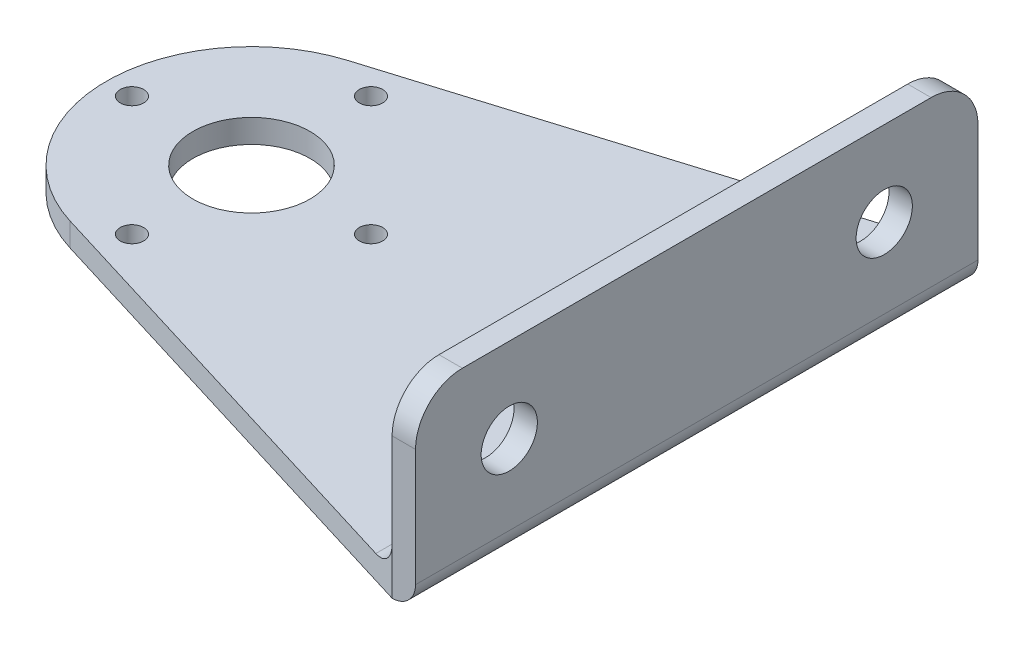
ISO-10303-21;
HEADER;
FILE_DESCRIPTION(('STEP AP214'),'2;1');
FILE_NAME('part.step','',(''),(''),'','','');
FILE_SCHEMA(('AUTOMOTIVE_DESIGN { 1 0 10303 214 1 1 1 1 }'));
ENDSEC;
DATA;
#1=APPLICATION_CONTEXT('core data for automotive mechanical design processes');
#2=APPLICATION_PROTOCOL_DEFINITION('international standard','automotive_design',2000,#1);
#3=PRODUCT_CONTEXT('',#1,'mechanical');
#4=PRODUCT('Part','Part','',(#3));
#5=PRODUCT_RELATED_PRODUCT_CATEGORY('part','',(#4));
#6=PRODUCT_DEFINITION_FORMATION('','',#4);
#7=PRODUCT_DEFINITION_CONTEXT('part definition',#1,'design');
#8=PRODUCT_DEFINITION('design','',#6,#7);
#9=PRODUCT_DEFINITION_SHAPE('','',#8);
#10=(LENGTH_UNIT() NAMED_UNIT(*) SI_UNIT(.MILLI.,.METRE.));
#11=(NAMED_UNIT(*) PLANE_ANGLE_UNIT() SI_UNIT($,.RADIAN.));
#12=(NAMED_UNIT(*) SI_UNIT($,.STERADIAN.) SOLID_ANGLE_UNIT());
#13=UNCERTAINTY_MEASURE_WITH_UNIT(LENGTH_MEASURE(1.E-05),#10,'distance_accuracy_value','');
#14=(GEOMETRIC_REPRESENTATION_CONTEXT(3) GLOBAL_UNCERTAINTY_ASSIGNED_CONTEXT((#13)) GLOBAL_UNIT_ASSIGNED_CONTEXT((#10,
#11,#12)) REPRESENTATION_CONTEXT('',''));
#15=CARTESIAN_POINT('',(0.,0.,0.));
#16=DIRECTION('',(0.,0.,1.));
#17=DIRECTION('',(1.,0.,0.));
#18=AXIS2_PLACEMENT_3D('',#15,#16,#17);
#19=CARTESIAN_POINT('',(0.,5.,0.));
#20=DIRECTION('',(0.,1.,0.));
#21=DIRECTION('',(0.,0.,1.));
#22=AXIS2_PLACEMENT_3D('',#19,#20,#21);
#23=PLANE('',#22);
#24=CARTESIAN_POINT('',(0.,5.,25.5));
#25=DIRECTION('',(0.,1.,0.));
#26=DIRECTION('',(0.,0.,1.));
#27=AXIS2_PLACEMENT_3D('',#24,#25,#26);
#28=CIRCLE('',#27,2.5);
#29=CARTESIAN_POINT('',(0.,5.,28.));
#30=VERTEX_POINT('',#29);
#31=EDGE_CURVE('E163',#30,#30,#28,.T.);
#32=ORIENTED_EDGE('',*,*,#31,.F.);
#33=EDGE_LOOP('',(#32));
#34=FACE_BOUND('',#33,.T.);
#35=CARTESIAN_POINT('',(-25.5,5.,0.));
#36=DIRECTION('',(0.,1.,0.));
#37=DIRECTION('',(0.,0.,1.));
#38=AXIS2_PLACEMENT_3D('',#35,#36,#37);
#39=CIRCLE('',#38,2.5);
#40=CARTESIAN_POINT('',(-25.5,5.,2.5));
#41=VERTEX_POINT('',#40);
#42=EDGE_CURVE('E175',#41,#41,#39,.T.);
#43=ORIENTED_EDGE('',*,*,#42,.F.);
#44=EDGE_LOOP('',(#43));
#45=FACE_BOUND('',#44,.T.);
#46=DIRECTION('',(0.956121639583312,0.,0.29296998194443));
#47=VECTOR('',#46,1.);
#48=CARTESIAN_POINT('',(90.,5.,60.));
#49=LINE('',#48,#47);
#50=CARTESIAN_POINT('',(-9.08206944027734,5.,29.6397708270826));
#51=VERTEX_POINT('',#50);
#52=CARTESIAN_POINT('',(85.,5.,58.4679251581833));
#53=VERTEX_POINT('',#52);
#54=EDGE_CURVE('E187',#51,#53,#49,.T.);
#55=ORIENTED_EDGE('',*,*,#54,.T.);
#56=DIRECTION('',(0.,0.,-1.));
#57=VECTOR('',#56,1.);
#58=CARTESIAN_POINT('',(85.,5.,-60.));
#59=LINE('',#58,#57);
#60=CARTESIAN_POINT('',(85.,5.,-58.4679251581833));
#61=VERTEX_POINT('',#60);
#62=EDGE_CURVE('E217',#53,#61,#59,.T.);
#63=ORIENTED_EDGE('',*,*,#62,.T.);
#64=DIRECTION('',(-0.956121639583312,0.,0.292969981944431));
#65=VECTOR('',#64,1.);
#66=CARTESIAN_POINT('',(90.,5.,-60.));
#67=LINE('',#66,#65);
#68=CARTESIAN_POINT('',(-9.08206944027735,5.,-29.6397708270826));
#69=VERTEX_POINT('',#68);
#70=EDGE_CURVE('E190',#61,#69,#67,.T.);
#71=ORIENTED_EDGE('',*,*,#70,.T.);
#72=CARTESIAN_POINT('',(0.,5.,0.));
#73=DIRECTION('',(0.,1.,0.));
#74=DIRECTION('',(0.,0.,1.));
#75=AXIS2_PLACEMENT_3D('',#72,#73,#74);
#76=CIRCLE('',#75,31.);
#77=EDGE_CURVE('E193',#69,#51,#76,.T.);
#78=ORIENTED_EDGE('',*,*,#77,.T.);
#79=EDGE_LOOP('',(#55,#63,#71,#78));
#80=FACE_BOUND('',#79,.T.);
#81=CARTESIAN_POINT('',(0.,5.,-25.5));
#82=DIRECTION('',(0.,1.,0.));
#83=DIRECTION('',(0.,0.,1.));
#84=AXIS2_PLACEMENT_3D('',#81,#82,#83);
#85=CIRCLE('',#84,2.5);
#86=CARTESIAN_POINT('',(0.,5.,-23.));
#87=VERTEX_POINT('',#86);
#88=EDGE_CURVE('E181',#87,#87,#85,.T.);
#89=ORIENTED_EDGE('',*,*,#88,.F.);
#90=EDGE_LOOP('',(#89));
#91=FACE_BOUND('',#90,.T.);
#92=CARTESIAN_POINT('',(25.5,5.,0.));
#93=DIRECTION('',(0.,1.,0.));
#94=DIRECTION('',(0.,0.,1.));
#95=AXIS2_PLACEMENT_3D('',#92,#93,#94);
#96=CIRCLE('',#95,2.5);
#97=CARTESIAN_POINT('',(25.5,5.,2.5));
#98=VERTEX_POINT('',#97);
#99=EDGE_CURVE('E169',#98,#98,#96,.T.);
#100=ORIENTED_EDGE('',*,*,#99,.F.);
#101=EDGE_LOOP('',(#100));
#102=FACE_BOUND('',#101,.T.);
#103=CARTESIAN_POINT('',(0.,5.,0.));
#104=DIRECTION('',(0.,1.,0.));
#105=DIRECTION('',(0.,0.,1.));
#106=AXIS2_PLACEMENT_3D('',#103,#104,#105);
#107=CIRCLE('',#106,12.5);
#108=CARTESIAN_POINT('',(0.,5.,12.5));
#109=VERTEX_POINT('',#108);
#110=EDGE_CURVE('E157',#109,#109,#107,.T.);
#111=ORIENTED_EDGE('',*,*,#110,.F.);
#112=EDGE_LOOP('',(#111));
#113=FACE_BOUND('',#112,.T.);
#114=ADVANCED_FACE('F38',(#34,#45,#80,#91,#102,#113),#23,.T.);
#115=CARTESIAN_POINT('',(0.,0.,0.));
#116=DIRECTION('',(0.,1.,0.));
#117=DIRECTION('',(0.,0.,1.));
#118=AXIS2_PLACEMENT_3D('',#115,#116,#117);
#119=PLANE('',#118);
#120=DIRECTION('',(-0.956121639583312,0.,0.292969981944431));
#121=VECTOR('',#120,1.);
#122=CARTESIAN_POINT('',(90.,0.,-60.));
#123=LINE('',#122,#121);
#124=CARTESIAN_POINT('',(90.,0.,-60.));
#125=VERTEX_POINT('',#124);
#126=CARTESIAN_POINT('',(-9.08206944027735,0.,-29.6397708270826));
#127=VERTEX_POINT('',#126);
#128=EDGE_CURVE('E198',#125,#127,#123,.T.);
#129=ORIENTED_EDGE('',*,*,#128,.F.);
#130=DIRECTION('',(0.,0.,-1.));
#131=VECTOR('',#130,1.);
#132=CARTESIAN_POINT('',(90.,0.,0.));
#133=LINE('',#132,#131);
#134=CARTESIAN_POINT('',(90.,0.,60.));
#135=VERTEX_POINT('',#134);
#136=EDGE_CURVE('E213',#125,#135,#133,.F.);
#137=ORIENTED_EDGE('',*,*,#136,.T.);
#138=DIRECTION('',(0.956121639583312,0.,0.29296998194443));
#139=VECTOR('',#138,1.);
#140=CARTESIAN_POINT('',(90.,0.,60.));
#141=LINE('',#140,#139);
#142=CARTESIAN_POINT('',(-9.08206944027734,0.,29.6397708270826));
#143=VERTEX_POINT('',#142);
#144=EDGE_CURVE('E184',#143,#135,#141,.T.);
#145=ORIENTED_EDGE('',*,*,#144,.F.);
#146=CARTESIAN_POINT('',(0.,0.,0.));
#147=DIRECTION('',(0.,1.,0.));
#148=DIRECTION('',(0.,0.,1.));
#149=AXIS2_PLACEMENT_3D('',#146,#147,#148);
#150=CIRCLE('',#149,31.);
#151=EDGE_CURVE('E191',#127,#143,#150,.T.);
#152=ORIENTED_EDGE('',*,*,#151,.F.);
#153=EDGE_LOOP('',(#129,#137,#145,#152));
#154=FACE_BOUND('',#153,.T.);
#155=CARTESIAN_POINT('',(0.,0.,-25.5));
#156=DIRECTION('',(0.,1.,0.));
#157=DIRECTION('',(0.,0.,1.));
#158=AXIS2_PLACEMENT_3D('',#155,#156,#157);
#159=CIRCLE('',#158,2.5);
#160=CARTESIAN_POINT('',(0.,0.,-23.));
#161=VERTEX_POINT('',#160);
#162=EDGE_CURVE('E178',#161,#161,#159,.T.);
#163=ORIENTED_EDGE('',*,*,#162,.T.);
#164=EDGE_LOOP('',(#163));
#165=FACE_BOUND('',#164,.T.);
#166=CARTESIAN_POINT('',(-25.5,0.,0.));
#167=DIRECTION('',(0.,1.,0.));
#168=DIRECTION('',(0.,0.,1.));
#169=AXIS2_PLACEMENT_3D('',#166,#167,#168);
#170=CIRCLE('',#169,2.5);
#171=CARTESIAN_POINT('',(-25.5,0.,2.5));
#172=VERTEX_POINT('',#171);
#173=EDGE_CURVE('E172',#172,#172,#170,.T.);
#174=ORIENTED_EDGE('',*,*,#173,.T.);
#175=EDGE_LOOP('',(#174));
#176=FACE_BOUND('',#175,.T.);
#177=CARTESIAN_POINT('',(25.5,0.,0.));
#178=DIRECTION('',(0.,1.,0.));
#179=DIRECTION('',(0.,0.,1.));
#180=AXIS2_PLACEMENT_3D('',#177,#178,#179);
#181=CIRCLE('',#180,2.5);
#182=CARTESIAN_POINT('',(25.5,0.,2.5));
#183=VERTEX_POINT('',#182);
#184=EDGE_CURVE('E166',#183,#183,#181,.T.);
#185=ORIENTED_EDGE('',*,*,#184,.T.);
#186=EDGE_LOOP('',(#185));
#187=FACE_BOUND('',#186,.T.);
#188=CARTESIAN_POINT('',(0.,0.,25.5));
#189=DIRECTION('',(0.,1.,0.));
#190=DIRECTION('',(0.,0.,1.));
#191=AXIS2_PLACEMENT_3D('',#188,#189,#190);
#192=CIRCLE('',#191,2.5);
#193=CARTESIAN_POINT('',(0.,0.,28.));
#194=VERTEX_POINT('',#193);
#195=EDGE_CURVE('E160',#194,#194,#192,.T.);
#196=ORIENTED_EDGE('',*,*,#195,.T.);
#197=EDGE_LOOP('',(#196));
#198=FACE_BOUND('',#197,.T.);
#199=CARTESIAN_POINT('',(0.,0.,0.));
#200=DIRECTION('',(0.,1.,0.));
#201=DIRECTION('',(0.,0.,1.));
#202=AXIS2_PLACEMENT_3D('',#199,#200,#201);
#203=CIRCLE('',#202,12.5);
#204=CARTESIAN_POINT('',(0.,0.,12.5));
#205=VERTEX_POINT('',#204);
#206=EDGE_CURVE('E126',#205,#205,#203,.T.);
#207=ORIENTED_EDGE('',*,*,#206,.T.);
#208=EDGE_LOOP('',(#207));
#209=FACE_BOUND('',#208,.T.);
#210=ADVANCED_FACE('F254',(#154,#165,#176,#187,#198,#209),#119,.F.);
#211=CARTESIAN_POINT('',(90.,5.,60.));
#212=DIRECTION('',(0.29296998194443,0.,-0.956121639583312));
#213=DIRECTION('',(-0.956121639583312,0.,-0.29296998194443));
#214=AXIS2_PLACEMENT_3D('',#211,#212,#213);
#215=PLANE('',#214);
#216=ORIENTED_EDGE('',*,*,#144,.T.);
#217=DIRECTION('',(0.,-1.,0.));
#218=VECTOR('',#217,1.);
#219=CARTESIAN_POINT('',(90.,5.,60.));
#220=LINE('',#219,#218);
#221=CARTESIAN_POINT('',(90.,10.,60.));
#222=VERTEX_POINT('',#221);
#223=EDGE_CURVE('E207',#222,#135,#220,.T.);
#224=ORIENTED_EDGE('',*,*,#223,.F.);
#225=CARTESIAN_POINT('',(85.,10.,58.4679251581833));
#226=DIRECTION('',(0.29296998194443,0.,-0.956121639583312));
#227=DIRECTION('',(0.956121639583312,0.,0.29296998194443));
#228=AXIS2_PLACEMENT_3D('',#225,#226,#227);
#229=ELLIPSE('',#228,5.22946013666112,5.);
#230=EDGE_CURVE('E11',#222,#53,#229,.T.);
#231=ORIENTED_EDGE('',*,*,#230,.T.);
#232=ORIENTED_EDGE('',*,*,#54,.F.);
#233=DIRECTION('',(0.,-1.,0.));
#234=VECTOR('',#233,1.);
#235=CARTESIAN_POINT('',(-9.08206944027734,5.,29.6397708270826));
#236=LINE('',#235,#234);
#237=EDGE_CURVE('E195',#51,#143,#236,.T.);
#238=ORIENTED_EDGE('',*,*,#237,.T.);
#239=EDGE_LOOP('',(#216,#224,#231,#232,#238));
#240=FACE_BOUND('',#239,.T.);
#241=ADVANCED_FACE('F265',(#240),#215,.F.);
#242=CARTESIAN_POINT('',(90.,5.,-60.));
#243=DIRECTION('',(0.292969981944431,0.,0.956121639583312));
#244=DIRECTION('',(0.956121639583312,0.,-0.292969981944431));
#245=AXIS2_PLACEMENT_3D('',#242,#243,#244);
#246=PLANE('',#245);
#247=ORIENTED_EDGE('',*,*,#128,.T.);
#248=DIRECTION('',(0.,-1.,0.));
#249=VECTOR('',#248,1.);
#250=CARTESIAN_POINT('',(-9.08206944027735,5.,-29.6397708270826));
#251=LINE('',#250,#249);
#252=EDGE_CURVE('E203',#69,#127,#251,.T.);
#253=ORIENTED_EDGE('',*,*,#252,.F.);
#254=ORIENTED_EDGE('',*,*,#70,.F.);
#255=CARTESIAN_POINT('',(85.,10.,-58.4679251581833));
#256=DIRECTION('',(0.292969981944431,0.,0.956121639583312));
#257=DIRECTION('',(-0.956121639583312,0.,0.292969981944431));
#258=AXIS2_PLACEMENT_3D('',#255,#256,#257);
#259=ELLIPSE('',#258,5.22946013666112,5.);
#260=CARTESIAN_POINT('',(90.,10.,-60.));
#261=VERTEX_POINT('',#260);
#262=EDGE_CURVE('E47',#61,#261,#259,.T.);
#263=ORIENTED_EDGE('',*,*,#262,.T.);
#264=DIRECTION('',(0.,-1.,0.));
#265=VECTOR('',#264,1.);
#266=CARTESIAN_POINT('',(90.,5.,-60.));
#267=LINE('',#266,#265);
#268=EDGE_CURVE('E54',#261,#125,#267,.T.);
#269=ORIENTED_EDGE('',*,*,#268,.T.);
#270=EDGE_LOOP('',(#247,#253,#254,#263,#269));
#271=FACE_BOUND('',#270,.T.);
#272=ADVANCED_FACE('F226',(#271),#246,.F.);
#273=CARTESIAN_POINT('',(0.,5.,0.));
#274=DIRECTION('',(0.,-1.,0.));
#275=DIRECTION('',(0.,0.,-1.));
#276=AXIS2_PLACEMENT_3D('',#273,#274,#275);
#277=CYLINDRICAL_SURFACE('',#276,31.);
#278=ORIENTED_EDGE('',*,*,#151,.T.);
#279=ORIENTED_EDGE('',*,*,#237,.F.);
#280=ORIENTED_EDGE('',*,*,#77,.F.);
#281=ORIENTED_EDGE('',*,*,#252,.T.);
#282=EDGE_LOOP('',(#278,#279,#280,#281));
#283=FACE_BOUND('',#282,.T.);
#284=ADVANCED_FACE('F259',(#283),#277,.T.);
#285=CARTESIAN_POINT('',(0.,5.,-25.5));
#286=DIRECTION('',(0.,-1.,0.));
#287=DIRECTION('',(0.,0.,-1.));
#288=AXIS2_PLACEMENT_3D('',#285,#286,#287);
#289=CYLINDRICAL_SURFACE('',#288,2.5);
#290=ORIENTED_EDGE('',*,*,#88,.T.);
#291=EDGE_LOOP('',(#290));
#292=FACE_BOUND('',#291,.T.);
#293=ORIENTED_EDGE('',*,*,#162,.F.);
#294=EDGE_LOOP('',(#293));
#295=FACE_BOUND('',#294,.T.);
#296=ADVANCED_FACE('F282',(#292,#295),#289,.F.);
#297=CARTESIAN_POINT('',(-25.5,5.,0.));
#298=DIRECTION('',(0.,-1.,0.));
#299=DIRECTION('',(0.,0.,-1.));
#300=AXIS2_PLACEMENT_3D('',#297,#298,#299);
#301=CYLINDRICAL_SURFACE('',#300,2.5);
#302=ORIENTED_EDGE('',*,*,#42,.T.);
#303=EDGE_LOOP('',(#302));
#304=FACE_BOUND('',#303,.T.);
#305=ORIENTED_EDGE('',*,*,#173,.F.);
#306=EDGE_LOOP('',(#305));
#307=FACE_BOUND('',#306,.T.);
#308=ADVANCED_FACE('F289',(#304,#307),#301,.F.);
#309=CARTESIAN_POINT('',(25.5,5.,0.));
#310=DIRECTION('',(0.,-1.,0.));
#311=DIRECTION('',(0.,0.,-1.));
#312=AXIS2_PLACEMENT_3D('',#309,#310,#311);
#313=CYLINDRICAL_SURFACE('',#312,2.5);
#314=ORIENTED_EDGE('',*,*,#99,.T.);
#315=EDGE_LOOP('',(#314));
#316=FACE_BOUND('',#315,.T.);
#317=ORIENTED_EDGE('',*,*,#184,.F.);
#318=EDGE_LOOP('',(#317));
#319=FACE_BOUND('',#318,.T.);
#320=ADVANCED_FACE('F294',(#316,#319),#313,.F.);
#321=CARTESIAN_POINT('',(0.,5.,25.5));
#322=DIRECTION('',(0.,-1.,0.));
#323=DIRECTION('',(0.,0.,-1.));
#324=AXIS2_PLACEMENT_3D('',#321,#322,#323);
#325=CYLINDRICAL_SURFACE('',#324,2.5);
#326=ORIENTED_EDGE('',*,*,#31,.T.);
#327=EDGE_LOOP('',(#326));
#328=FACE_BOUND('',#327,.T.);
#329=ORIENTED_EDGE('',*,*,#195,.F.);
#330=EDGE_LOOP('',(#329));
#331=FACE_BOUND('',#330,.T.);
#332=ADVANCED_FACE('F310',(#328,#331),#325,.F.);
#333=CARTESIAN_POINT('',(0.,5.,0.));
#334=DIRECTION('',(0.,-1.,0.));
#335=DIRECTION('',(0.,0.,-1.));
#336=AXIS2_PLACEMENT_3D('',#333,#334,#335);
#337=CYLINDRICAL_SURFACE('',#336,12.5);
#338=ORIENTED_EDGE('',*,*,#110,.T.);
#339=EDGE_LOOP('',(#338));
#340=FACE_BOUND('',#339,.T.);
#341=ORIENTED_EDGE('',*,*,#206,.F.);
#342=EDGE_LOOP('',(#341));
#343=FACE_BOUND('',#342,.T.);
#344=ADVANCED_FACE('F308',(#340,#343),#337,.F.);
#345=CARTESIAN_POINT('',(90.,30.,50.));
#346=DIRECTION('',(-1.,0.,0.));
#347=DIRECTION('',(0.,0.,1.));
#348=AXIS2_PLACEMENT_3D('',#345,#346,#347);
#349=PLANE('',#348);
#350=CARTESIAN_POINT('',(90.,22.,40.));
#351=DIRECTION('',(-1.,0.,0.));
#352=DIRECTION('',(0.,0.,1.));
#353=AXIS2_PLACEMENT_3D('',#350,#351,#352);
#354=CIRCLE('',#353,5.99999999999999);
#355=CARTESIAN_POINT('',(90.,22.,46.));
#356=VERTEX_POINT('',#355);
#357=EDGE_CURVE('E143',#356,#356,#354,.T.);
#358=ORIENTED_EDGE('',*,*,#357,.F.);
#359=EDGE_LOOP('',(#358));
#360=FACE_BOUND('',#359,.T.);
#361=CARTESIAN_POINT('',(90.,22.,-40.));
#362=DIRECTION('',(-1.,0.,0.));
#363=DIRECTION('',(0.,0.,1.));
#364=AXIS2_PLACEMENT_3D('',#361,#362,#363);
#365=CIRCLE('',#364,5.99999999999999);
#366=CARTESIAN_POINT('',(90.,22.,-34.));
#367=VERTEX_POINT('',#366);
#368=EDGE_CURVE('E462',#367,#367,#365,.T.);
#369=ORIENTED_EDGE('',*,*,#368,.F.);
#370=EDGE_LOOP('',(#369));
#371=FACE_BOUND('',#370,.T.);
#372=DIRECTION('',(0.,1.,0.));
#373=VECTOR('',#372,1.);
#374=CARTESIAN_POINT('',(90.,0.,-60.));
#375=LINE('',#374,#373);
#376=CARTESIAN_POINT('',(90.,30.,-60.));
#377=VERTEX_POINT('',#376);
#378=EDGE_CURVE('E123',#261,#377,#375,.T.);
#379=ORIENTED_EDGE('',*,*,#378,.F.);
#380=DIRECTION('',(0.,0.,-1.));
#381=VECTOR('',#380,1.);
#382=CARTESIAN_POINT('',(90.,10.,60.));
#383=LINE('',#382,#381);
#384=EDGE_CURVE('E220',#261,#222,#383,.F.);
#385=ORIENTED_EDGE('',*,*,#384,.T.);
#386=DIRECTION('',(0.,-1.,0.));
#387=VECTOR('',#386,1.);
#388=CARTESIAN_POINT('',(90.,0.,60.));
#389=LINE('',#388,#387);
#390=CARTESIAN_POINT('',(90.,30.,60.));
#391=VERTEX_POINT('',#390);
#392=EDGE_CURVE('E140',#391,#222,#389,.T.);
#393=ORIENTED_EDGE('',*,*,#392,.F.);
#394=CARTESIAN_POINT('',(90.,30.,50.));
#395=DIRECTION('',(1.,0.,0.));
#396=DIRECTION('',(0.,0.,1.));
#397=AXIS2_PLACEMENT_3D('',#394,#395,#396);
#398=CIRCLE('',#397,10.);
#399=CARTESIAN_POINT('',(90.,40.,50.));
#400=VERTEX_POINT('',#399);
#401=EDGE_CURVE('E149',#400,#391,#398,.T.);
#402=ORIENTED_EDGE('',*,*,#401,.F.);
#403=DIRECTION('',(0.,0.,1.));
#404=VECTOR('',#403,1.);
#405=CARTESIAN_POINT('',(90.,40.,50.));
#406=LINE('',#405,#404);
#407=CARTESIAN_POINT('',(90.,40.,-50.));
#408=VERTEX_POINT('',#407);
#409=EDGE_CURVE('E147',#408,#400,#406,.T.);
#410=ORIENTED_EDGE('',*,*,#409,.F.);
#411=CARTESIAN_POINT('',(90.,30.,-50.));
#412=DIRECTION('',(1.,0.,0.));
#413=DIRECTION('',(0.,0.,1.));
#414=AXIS2_PLACEMENT_3D('',#411,#412,#413);
#415=CIRCLE('',#414,10.);
#416=EDGE_CURVE('E145',#377,#408,#415,.T.);
#417=ORIENTED_EDGE('',*,*,#416,.F.);
#418=EDGE_LOOP('',(#379,#385,#393,#402,#410,#417));
#419=FACE_BOUND('',#418,.T.);
#420=ADVANCED_FACE('F234',(#360,#371,#419),#349,.T.);
#421=CARTESIAN_POINT('',(95.,0.,60.));
#422=DIRECTION('',(0.,0.,-1.));
#423=DIRECTION('',(-1.,0.,0.));
#424=AXIS2_PLACEMENT_3D('',#421,#422,#423);
#425=PLANE('',#424);
#426=ORIENTED_EDGE('',*,*,#223,.T.);
#427=CARTESIAN_POINT('',(90.,5.,60.));
#428=DIRECTION('',(0.,0.,-1.));
#429=DIRECTION('',(-1.,0.,0.));
#430=AXIS2_PLACEMENT_3D('',#427,#428,#429);
#431=CIRCLE('',#430,5.);
#432=CARTESIAN_POINT('',(95.,5.,60.));
#433=VERTEX_POINT('',#432);
#434=EDGE_CURVE('E215',#135,#433,#431,.F.);
#435=ORIENTED_EDGE('',*,*,#434,.T.);
#436=DIRECTION('',(0.,-1.,0.));
#437=VECTOR('',#436,1.);
#438=CARTESIAN_POINT('',(95.,0.,60.));
#439=LINE('',#438,#437);
#440=CARTESIAN_POINT('',(95.,30.,60.));
#441=VERTEX_POINT('',#440);
#442=EDGE_CURVE('E118',#441,#433,#439,.T.);
#443=ORIENTED_EDGE('',*,*,#442,.F.);
#444=DIRECTION('',(-1.,0.,0.));
#445=VECTOR('',#444,1.);
#446=CARTESIAN_POINT('',(95.,30.,60.));
#447=LINE('',#446,#445);
#448=EDGE_CURVE('E139',#441,#391,#447,.T.);
#449=ORIENTED_EDGE('',*,*,#448,.T.);
#450=ORIENTED_EDGE('',*,*,#392,.T.);
#451=EDGE_LOOP('',(#426,#435,#443,#449,#450));
#452=FACE_BOUND('',#451,.T.);
#453=ADVANCED_FACE('F238',(#452),#425,.F.);
#454=CARTESIAN_POINT('',(95.,0.,-60.));
#455=DIRECTION('',(0.,0.,1.));
#456=DIRECTION('',(1.,0.,0.));
#457=AXIS2_PLACEMENT_3D('',#454,#455,#456);
#458=PLANE('',#457);
#459=DIRECTION('',(0.,1.,0.));
#460=VECTOR('',#459,1.);
#461=CARTESIAN_POINT('',(95.,0.,-60.));
#462=LINE('',#461,#460);
#463=CARTESIAN_POINT('',(95.,5.,-60.));
#464=VERTEX_POINT('',#463);
#465=CARTESIAN_POINT('',(95.,30.,-60.));
#466=VERTEX_POINT('',#465);
#467=EDGE_CURVE('E109',#464,#466,#462,.T.);
#468=ORIENTED_EDGE('',*,*,#467,.F.);
#469=CARTESIAN_POINT('',(90.,5.,-60.));
#470=DIRECTION('',(0.,0.,1.));
#471=DIRECTION('',(1.,0.,0.));
#472=AXIS2_PLACEMENT_3D('',#469,#470,#471);
#473=CIRCLE('',#472,5.);
#474=EDGE_CURVE('E211',#464,#125,#473,.F.);
#475=ORIENTED_EDGE('',*,*,#474,.T.);
#476=ORIENTED_EDGE('',*,*,#268,.F.);
#477=ORIENTED_EDGE('',*,*,#378,.T.);
#478=DIRECTION('',(-1.,0.,0.));
#479=VECTOR('',#478,1.);
#480=CARTESIAN_POINT('',(95.,30.,-60.));
#481=LINE('',#480,#479);
#482=EDGE_CURVE('E121',#466,#377,#481,.T.);
#483=ORIENTED_EDGE('',*,*,#482,.F.);
#484=EDGE_LOOP('',(#468,#475,#476,#477,#483));
#485=FACE_BOUND('',#484,.T.);
#486=ADVANCED_FACE('F122',(#485),#458,.F.);
#487=CARTESIAN_POINT('',(95.,30.,-50.));
#488=DIRECTION('',(-1.,0.,0.));
#489=DIRECTION('',(0.,0.,1.));
#490=AXIS2_PLACEMENT_3D('',#487,#488,#489);
#491=CYLINDRICAL_SURFACE('',#490,10.);
#492=ORIENTED_EDGE('',*,*,#416,.T.);
#493=DIRECTION('',(-1.,0.,0.));
#494=VECTOR('',#493,1.);
#495=CARTESIAN_POINT('',(95.,40.,-50.));
#496=LINE('',#495,#494);
#497=CARTESIAN_POINT('',(95.,40.,-50.));
#498=VERTEX_POINT('',#497);
#499=EDGE_CURVE('E127',#498,#408,#496,.T.);
#500=ORIENTED_EDGE('',*,*,#499,.F.);
#501=CARTESIAN_POINT('',(95.,30.,-50.));
#502=DIRECTION('',(1.,0.,0.));
#503=DIRECTION('',(0.,0.,1.));
#504=AXIS2_PLACEMENT_3D('',#501,#502,#503);
#505=CIRCLE('',#504,10.);
#506=EDGE_CURVE('E114',#466,#498,#505,.T.);
#507=ORIENTED_EDGE('',*,*,#506,.F.);
#508=ORIENTED_EDGE('',*,*,#482,.T.);
#509=EDGE_LOOP('',(#492,#500,#507,#508));
#510=FACE_BOUND('',#509,.T.);
#511=ADVANCED_FACE('F129',(#510),#491,.T.);
#512=CARTESIAN_POINT('',(95.,40.,50.));
#513=DIRECTION('',(0.,-1.,0.));
#514=DIRECTION('',(0.,0.,-1.));
#515=AXIS2_PLACEMENT_3D('',#512,#513,#514);
#516=PLANE('',#515);
#517=ORIENTED_EDGE('',*,*,#409,.T.);
#518=DIRECTION('',(-1.,0.,0.));
#519=VECTOR('',#518,1.);
#520=CARTESIAN_POINT('',(95.,40.,50.));
#521=LINE('',#520,#519);
#522=CARTESIAN_POINT('',(95.,40.,50.));
#523=VERTEX_POINT('',#522);
#524=EDGE_CURVE('E153',#523,#400,#521,.T.);
#525=ORIENTED_EDGE('',*,*,#524,.F.);
#526=DIRECTION('',(0.,0.,1.));
#527=VECTOR('',#526,1.);
#528=CARTESIAN_POINT('',(95.,40.,50.));
#529=LINE('',#528,#527);
#530=EDGE_CURVE('E132',#498,#523,#529,.T.);
#531=ORIENTED_EDGE('',*,*,#530,.F.);
#532=ORIENTED_EDGE('',*,*,#499,.T.);
#533=EDGE_LOOP('',(#517,#525,#531,#532));
#534=FACE_BOUND('',#533,.T.);
#535=ADVANCED_FACE('F247',(#534),#516,.F.);
#536=CARTESIAN_POINT('',(95.,30.,50.));
#537=DIRECTION('',(-1.,0.,0.));
#538=DIRECTION('',(0.,0.,1.));
#539=AXIS2_PLACEMENT_3D('',#536,#537,#538);
#540=CYLINDRICAL_SURFACE('',#539,10.);
#541=ORIENTED_EDGE('',*,*,#401,.T.);
#542=ORIENTED_EDGE('',*,*,#448,.F.);
#543=CARTESIAN_POINT('',(95.,30.,50.));
#544=DIRECTION('',(1.,0.,0.));
#545=DIRECTION('',(0.,0.,1.));
#546=AXIS2_PLACEMENT_3D('',#543,#544,#545);
#547=CIRCLE('',#546,10.);
#548=EDGE_CURVE('E134',#523,#441,#547,.T.);
#549=ORIENTED_EDGE('',*,*,#548,.F.);
#550=ORIENTED_EDGE('',*,*,#524,.T.);
#551=EDGE_LOOP('',(#541,#542,#549,#550));
#552=FACE_BOUND('',#551,.T.);
#553=ADVANCED_FACE('F243',(#552),#540,.T.);
#554=CARTESIAN_POINT('',(95.,30.,50.));
#555=DIRECTION('',(-1.,0.,0.));
#556=DIRECTION('',(0.,0.,1.));
#557=AXIS2_PLACEMENT_3D('',#554,#555,#556);
#558=PLANE('',#557);
#559=CARTESIAN_POINT('',(95.,22.,40.));
#560=DIRECTION('',(1.,0.,0.));
#561=DIRECTION('',(0.,0.,-1.));
#562=AXIS2_PLACEMENT_3D('',#559,#560,#561);
#563=CIRCLE('',#562,5.99999999999999);
#564=CARTESIAN_POINT('',(95.,22.,34.));
#565=VERTEX_POINT('',#564);
#566=EDGE_CURVE('E461',#565,#565,#563,.T.);
#567=ORIENTED_EDGE('',*,*,#566,.F.);
#568=EDGE_LOOP('',(#567));
#569=FACE_BOUND('',#568,.T.);
#570=CARTESIAN_POINT('',(95.,22.,-40.));
#571=DIRECTION('',(1.,0.,0.));
#572=DIRECTION('',(0.,0.,-1.));
#573=AXIS2_PLACEMENT_3D('',#570,#571,#572);
#574=CIRCLE('',#573,5.99999999999999);
#575=CARTESIAN_POINT('',(95.,22.,-46.));
#576=VERTEX_POINT('',#575);
#577=EDGE_CURVE('E463',#576,#576,#574,.T.);
#578=ORIENTED_EDGE('',*,*,#577,.F.);
#579=EDGE_LOOP('',(#578));
#580=FACE_BOUND('',#579,.T.);
#581=ORIENTED_EDGE('',*,*,#442,.T.);
#582=DIRECTION('',(0.,0.,-1.));
#583=VECTOR('',#582,1.);
#584=CARTESIAN_POINT('',(95.,5.,50.));
#585=LINE('',#584,#583);
#586=EDGE_CURVE('E117',#433,#464,#585,.T.);
#587=ORIENTED_EDGE('',*,*,#586,.T.);
#588=ORIENTED_EDGE('',*,*,#467,.T.);
#589=ORIENTED_EDGE('',*,*,#506,.T.);
#590=ORIENTED_EDGE('',*,*,#530,.T.);
#591=ORIENTED_EDGE('',*,*,#548,.T.);
#592=EDGE_LOOP('',(#581,#587,#588,#589,#590,#591));
#593=FACE_BOUND('',#592,.T.);
#594=ADVANCED_FACE('F112',(#569,#580,#593),#558,.F.);
#595=CARTESIAN_POINT('',(90.,5.,50.));
#596=DIRECTION('',(0.,0.,-1.));
#597=DIRECTION('',(-1.,0.,0.));
#598=AXIS2_PLACEMENT_3D('',#595,#596,#597);
#599=CYLINDRICAL_SURFACE('',#598,5.);
#600=ORIENTED_EDGE('',*,*,#434,.F.);
#601=ORIENTED_EDGE('',*,*,#136,.F.);
#602=ORIENTED_EDGE('',*,*,#474,.F.);
#603=ORIENTED_EDGE('',*,*,#586,.F.);
#604=EDGE_LOOP('',(#600,#601,#602,#603));
#605=FACE_BOUND('',#604,.T.);
#606=ADVANCED_FACE('F250',(#605),#599,.T.);
#607=CARTESIAN_POINT('',(85.,10.,0.));
#608=DIRECTION('',(0.,0.,1.));
#609=DIRECTION('',(1.,0.,0.));
#610=AXIS2_PLACEMENT_3D('',#607,#608,#609);
#611=CYLINDRICAL_SURFACE('',#610,5.);
#612=ORIENTED_EDGE('',*,*,#230,.F.);
#613=ORIENTED_EDGE('',*,*,#384,.F.);
#614=ORIENTED_EDGE('',*,*,#262,.F.);
#615=ORIENTED_EDGE('',*,*,#62,.F.);
#616=EDGE_LOOP('',(#612,#613,#614,#615));
#617=FACE_BOUND('',#616,.T.);
#618=ADVANCED_FACE('F40',(#617),#611,.F.);
#619=CARTESIAN_POINT('',(85.,22.,-40.));
#620=DIRECTION('',(1.,0.,0.));
#621=DIRECTION('',(0.,0.,-1.));
#622=AXIS2_PLACEMENT_3D('',#619,#620,#621);
#623=CYLINDRICAL_SURFACE('',#622,5.99999999999999);
#624=ORIENTED_EDGE('',*,*,#368,.T.);
#625=EDGE_LOOP('',(#624));
#626=FACE_BOUND('',#625,.T.);
#627=ORIENTED_EDGE('',*,*,#577,.T.);
#628=EDGE_LOOP('',(#627));
#629=FACE_BOUND('',#628,.T.);
#630=ADVANCED_FACE('F422',(#626,#629),#623,.F.);
#631=CARTESIAN_POINT('',(85.,22.,40.));
#632=DIRECTION('',(1.,0.,0.));
#633=DIRECTION('',(0.,0.,-1.));
#634=AXIS2_PLACEMENT_3D('',#631,#632,#633);
#635=CYLINDRICAL_SURFACE('',#634,5.99999999999999);
#636=ORIENTED_EDGE('',*,*,#357,.T.);
#637=EDGE_LOOP('',(#636));
#638=FACE_BOUND('',#637,.T.);
#639=ORIENTED_EDGE('',*,*,#566,.T.);
#640=EDGE_LOOP('',(#639));
#641=FACE_BOUND('',#640,.T.);
#642=ADVANCED_FACE('F442',(#638,#641),#635,.F.);
#643=CLOSED_SHELL('',(#114,#210,#241,#272,#284,#296,#308,#320,#332,#344,#420,#453,#486,#511,
#535,#553,#594,#606,#618,#630,#642));
#644=MANIFOLD_SOLID_BREP('B2',#643);
#645=ADVANCED_BREP_SHAPE_REPRESENTATION('',(#18,#644),#14);
#646=SHAPE_DEFINITION_REPRESENTATION(#9,#645);
ENDSEC;
END-ISO-10303-21;
